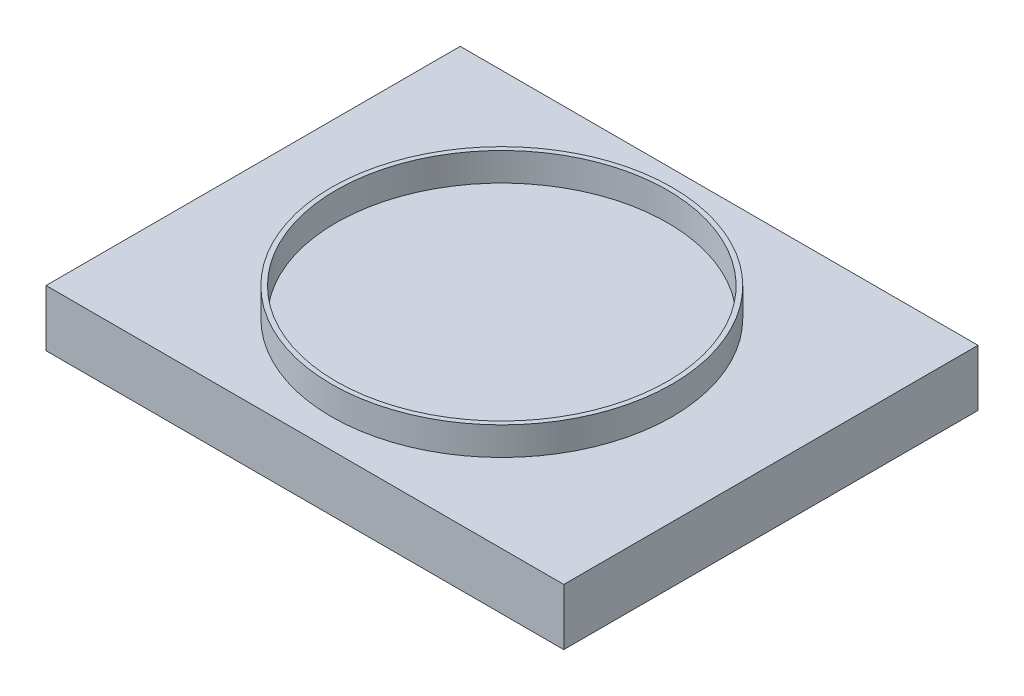
ISO-10303-21;
HEADER;
FILE_DESCRIPTION(('STEP AP214'),'2;1');
FILE_NAME('part.step','',(''),(''),'','','');
FILE_SCHEMA(('AUTOMOTIVE_DESIGN { 1 0 10303 214 1 1 1 1 }'));
ENDSEC;
DATA;
#1=APPLICATION_CONTEXT('core data for automotive mechanical design processes');
#2=APPLICATION_PROTOCOL_DEFINITION('international standard','automotive_design',2000,#1);
#3=PRODUCT_CONTEXT('',#1,'mechanical');
#4=PRODUCT('Part','Part','',(#3));
#5=PRODUCT_RELATED_PRODUCT_CATEGORY('part','',(#4));
#6=PRODUCT_DEFINITION_FORMATION('','',#4);
#7=PRODUCT_DEFINITION_CONTEXT('part definition',#1,'design');
#8=PRODUCT_DEFINITION('design','',#6,#7);
#9=PRODUCT_DEFINITION_SHAPE('','',#8);
#10=(LENGTH_UNIT() NAMED_UNIT(*) SI_UNIT(.MILLI.,.METRE.));
#11=(NAMED_UNIT(*) PLANE_ANGLE_UNIT() SI_UNIT($,.RADIAN.));
#12=(NAMED_UNIT(*) SI_UNIT($,.STERADIAN.) SOLID_ANGLE_UNIT());
#13=UNCERTAINTY_MEASURE_WITH_UNIT(LENGTH_MEASURE(1.E-05),#10,'distance_accuracy_value','');
#14=(GEOMETRIC_REPRESENTATION_CONTEXT(3) GLOBAL_UNCERTAINTY_ASSIGNED_CONTEXT((#13)) GLOBAL_UNIT_ASSIGNED_CONTEXT((#10,
#11,#12)) REPRESENTATION_CONTEXT('',''));
#15=CARTESIAN_POINT('',(0.,0.,0.));
#16=DIRECTION('',(0.,0.,1.));
#17=DIRECTION('',(1.,0.,0.));
#18=AXIS2_PLACEMENT_3D('',#15,#16,#17);
#19=CARTESIAN_POINT('',(0.,3.,46.7904600702146));
#20=DIRECTION('',(0.,-1.,0.));
#21=DIRECTION('',(0.,0.,-1.));
#22=AXIS2_PLACEMENT_3D('',#19,#20,#21);
#23=CYLINDRICAL_SURFACE('',#22,18.1);
#24=CARTESIAN_POINT('',(0.,0.,46.7904600702146));
#25=DIRECTION('',(0.,1.,0.));
#26=DIRECTION('',(0.,0.,1.));
#27=AXIS2_PLACEMENT_3D('',#24,#25,#26);
#28=CIRCLE('',#27,18.1);
#29=CARTESIAN_POINT('',(0.,0.,64.8904600702146));
#30=VERTEX_POINT('',#29);
#31=EDGE_CURVE('E41',#30,#30,#28,.T.);
#32=ORIENTED_EDGE('',*,*,#31,.T.);
#33=EDGE_LOOP('',(#32));
#34=FACE_BOUND('',#33,.T.);
#35=CARTESIAN_POINT('',(0.,3.,46.7904600702146));
#36=DIRECTION('',(0.,1.,0.));
#37=DIRECTION('',(0.,0.,1.));
#38=AXIS2_PLACEMENT_3D('',#35,#36,#37);
#39=CIRCLE('',#38,18.1);
#40=CARTESIAN_POINT('',(0.,3.,64.8904600702146));
#41=VERTEX_POINT('',#40);
#42=EDGE_CURVE('E11',#41,#41,#39,.T.);
#43=ORIENTED_EDGE('',*,*,#42,.F.);
#44=EDGE_LOOP('',(#43));
#45=FACE_BOUND('',#44,.T.);
#46=ADVANCED_FACE('F38',(#34,#45),#23,.T.);
#47=CARTESIAN_POINT('',(0.,3.,46.7904600702146));
#48=DIRECTION('',(0.,1.,0.));
#49=DIRECTION('',(0.,0.,1.));
#50=AXIS2_PLACEMENT_3D('',#47,#48,#49);
#51=PLANE('',#50);
#52=CARTESIAN_POINT('',(0.,3.,46.7904600702146));
#53=DIRECTION('',(0.,1.,0.));
#54=DIRECTION('',(0.,0.,1.));
#55=AXIS2_PLACEMENT_3D('',#52,#53,#54);
#56=CIRCLE('',#55,17.6);
#57=CARTESIAN_POINT('',(0.,3.,64.3904600702146));
#58=VERTEX_POINT('',#57);
#59=EDGE_CURVE('E46',#58,#58,#56,.T.);
#60=ORIENTED_EDGE('',*,*,#59,.F.);
#61=EDGE_LOOP('',(#60));
#62=FACE_BOUND('',#61,.T.);
#63=ORIENTED_EDGE('',*,*,#42,.T.);
#64=EDGE_LOOP('',(#63));
#65=FACE_BOUND('',#64,.T.);
#66=ADVANCED_FACE('F212',(#62,#65),#51,.T.);
#67=CARTESIAN_POINT('',(0.,3.,46.7904600702146));
#68=DIRECTION('',(0.,-1.,0.));
#69=DIRECTION('',(0.,0.,-1.));
#70=AXIS2_PLACEMENT_3D('',#67,#68,#69);
#71=CYLINDRICAL_SURFACE('',#70,17.6);
#72=ORIENTED_EDGE('',*,*,#59,.T.);
#73=EDGE_LOOP('',(#72));
#74=FACE_BOUND('',#73,.T.);
#75=CARTESIAN_POINT('',(0.,0.,46.7904600702146));
#76=DIRECTION('',(0.,1.,0.));
#77=DIRECTION('',(0.,0.,1.));
#78=AXIS2_PLACEMENT_3D('',#75,#76,#77);
#79=CIRCLE('',#78,17.6);
#80=CARTESIAN_POINT('',(0.,0.,64.3904600702146));
#81=VERTEX_POINT('',#80);
#82=EDGE_CURVE('E178',#81,#81,#79,.T.);
#83=ORIENTED_EDGE('',*,*,#82,.F.);
#84=EDGE_LOOP('',(#83));
#85=FACE_BOUND('',#84,.T.);
#86=ADVANCED_FACE('F216',(#74,#85),#71,.F.);
#87=CARTESIAN_POINT('',(0.,0.,46.7904600702146));
#88=DIRECTION('',(0.,1.,0.));
#89=DIRECTION('',(0.,0.,1.));
#90=AXIS2_PLACEMENT_3D('',#87,#88,#89);
#91=PLANE('',#90);
#92=ORIENTED_EDGE('',*,*,#82,.T.);
#93=EDGE_LOOP('',(#92));
#94=FACE_BOUND('',#93,.T.);
#95=ADVANCED_FACE('F209',(#94),#91,.T.);
#96=CARTESIAN_POINT('',(27.7675454174685,-6.,67.974099662761));
#97=DIRECTION('',(0.,0.,-1.));
#98=DIRECTION('',(-1.,0.,0.));
#99=AXIS2_PLACEMENT_3D('',#96,#97,#98);
#100=PLANE('',#99);
#101=DIRECTION('',(-1.,0.,0.));
#102=VECTOR('',#101,1.);
#103=CARTESIAN_POINT('',(27.7675454174685,0.,67.974099662761));
#104=LINE('',#103,#102);
#105=CARTESIAN_POINT('',(27.7675454174685,0.,67.974099662761));
#106=VERTEX_POINT('',#105);
#107=CARTESIAN_POINT('',(-27.2324545825315,0.,67.974099662761));
#108=VERTEX_POINT('',#107);
#109=EDGE_CURVE('E147',#106,#108,#104,.T.);
#110=ORIENTED_EDGE('',*,*,#109,.T.);
#111=DIRECTION('',(0.,1.,0.));
#112=VECTOR('',#111,1.);
#113=CARTESIAN_POINT('',(-27.2324545825315,-6.,67.974099662761));
#114=LINE('',#113,#112);
#115=CARTESIAN_POINT('',(-27.2324545825315,-6.,67.974099662761));
#116=VERTEX_POINT('',#115);
#117=EDGE_CURVE('E174',#116,#108,#114,.T.);
#118=ORIENTED_EDGE('',*,*,#117,.F.);
#119=DIRECTION('',(-1.,0.,0.));
#120=VECTOR('',#119,1.);
#121=CARTESIAN_POINT('',(27.7675454174685,-6.,67.974099662761));
#122=LINE('',#121,#120);
#123=CARTESIAN_POINT('',(27.7675454174685,-6.,67.974099662761));
#124=VERTEX_POINT('',#123);
#125=EDGE_CURVE('E88',#124,#116,#122,.T.);
#126=ORIENTED_EDGE('',*,*,#125,.F.);
#127=DIRECTION('',(0.,1.,0.));
#128=VECTOR('',#127,1.);
#129=CARTESIAN_POINT('',(27.7675454174685,-6.,67.974099662761));
#130=LINE('',#129,#128);
#131=EDGE_CURVE('E159',#124,#106,#130,.T.);
#132=ORIENTED_EDGE('',*,*,#131,.T.);
#133=EDGE_LOOP('',(#110,#118,#126,#132));
#134=FACE_BOUND('',#133,.T.);
#135=ADVANCED_FACE('F196',(#134),#100,.F.);
#136=CARTESIAN_POINT('',(-27.2324545825315,-6.,23.974099662761));
#137=DIRECTION('',(-1.,0.,0.));
#138=DIRECTION('',(0.,0.,1.));
#139=AXIS2_PLACEMENT_3D('',#136,#137,#138);
#140=PLANE('',#139);
#141=DIRECTION('',(0.,0.,1.));
#142=VECTOR('',#141,1.);
#143=CARTESIAN_POINT('',(-27.2324545825315,0.,23.974099662761));
#144=LINE('',#143,#142);
#145=CARTESIAN_POINT('',(-27.2324545825315,0.,23.974099662761));
#146=VERTEX_POINT('',#145);
#147=EDGE_CURVE('E162',#146,#108,#144,.T.);
#148=ORIENTED_EDGE('',*,*,#147,.F.);
#149=DIRECTION('',(0.,1.,0.));
#150=VECTOR('',#149,1.);
#151=CARTESIAN_POINT('',(-27.2324545825315,-6.,23.974099662761));
#152=LINE('',#151,#150);
#153=CARTESIAN_POINT('',(-27.2324545825315,-6.,23.974099662761));
#154=VERTEX_POINT('',#153);
#155=EDGE_CURVE('E172',#154,#146,#152,.T.);
#156=ORIENTED_EDGE('',*,*,#155,.F.);
#157=DIRECTION('',(0.,0.,1.));
#158=VECTOR('',#157,1.);
#159=CARTESIAN_POINT('',(-27.2324545825315,-6.,23.974099662761));
#160=LINE('',#159,#158);
#161=EDGE_CURVE('E152',#154,#116,#160,.T.);
#162=ORIENTED_EDGE('',*,*,#161,.T.);
#163=ORIENTED_EDGE('',*,*,#117,.T.);
#164=EDGE_LOOP('',(#148,#156,#162,#163));
#165=FACE_BOUND('',#164,.T.);
#166=ADVANCED_FACE('F201',(#165),#140,.T.);
#167=CARTESIAN_POINT('',(27.7675454174685,-6.,23.9740996627611));
#168=DIRECTION('',(0.,0.,-1.));
#169=DIRECTION('',(-1.,0.,0.));
#170=AXIS2_PLACEMENT_3D('',#167,#168,#169);
#171=PLANE('',#170);
#172=DIRECTION('',(-1.,0.,0.));
#173=VECTOR('',#172,1.);
#174=CARTESIAN_POINT('',(27.7675454174685,0.,23.9740996627611));
#175=LINE('',#174,#173);
#176=CARTESIAN_POINT('',(27.7675454174685,0.,23.9740996627611));
#177=VERTEX_POINT('',#176);
#178=EDGE_CURVE('E165',#177,#146,#175,.T.);
#179=ORIENTED_EDGE('',*,*,#178,.F.);
#180=DIRECTION('',(0.,1.,0.));
#181=VECTOR('',#180,1.);
#182=CARTESIAN_POINT('',(27.7675454174685,-6.,23.9740996627611));
#183=LINE('',#182,#181);
#184=CARTESIAN_POINT('',(27.7675454174685,-6.,23.9740996627611));
#185=VERTEX_POINT('',#184);
#186=EDGE_CURVE('E170',#185,#177,#183,.T.);
#187=ORIENTED_EDGE('',*,*,#186,.F.);
#188=DIRECTION('',(-1.,0.,0.));
#189=VECTOR('',#188,1.);
#190=CARTESIAN_POINT('',(27.7675454174685,-6.,23.9740996627611));
#191=LINE('',#190,#189);
#192=EDGE_CURVE('E155',#185,#154,#191,.T.);
#193=ORIENTED_EDGE('',*,*,#192,.T.);
#194=ORIENTED_EDGE('',*,*,#155,.T.);
#195=EDGE_LOOP('',(#179,#187,#193,#194));
#196=FACE_BOUND('',#195,.T.);
#197=ADVANCED_FACE('F199',(#196),#171,.T.);
#198=CARTESIAN_POINT('',(27.7675454174685,-6.,23.9740996627611));
#199=DIRECTION('',(-1.,0.,0.));
#200=DIRECTION('',(0.,0.,1.));
#201=AXIS2_PLACEMENT_3D('',#198,#199,#200);
#202=PLANE('',#201);
#203=DIRECTION('',(0.,0.,1.));
#204=VECTOR('',#203,1.);
#205=CARTESIAN_POINT('',(27.7675454174685,0.,23.9740996627611));
#206=LINE('',#205,#204);
#207=EDGE_CURVE('E83',#177,#106,#206,.T.);
#208=ORIENTED_EDGE('',*,*,#207,.T.);
#209=ORIENTED_EDGE('',*,*,#131,.F.);
#210=DIRECTION('',(0.,0.,1.));
#211=VECTOR('',#210,1.);
#212=CARTESIAN_POINT('',(27.7675454174685,-6.,23.9740996627611));
#213=LINE('',#212,#211);
#214=EDGE_CURVE('E62',#185,#124,#213,.T.);
#215=ORIENTED_EDGE('',*,*,#214,.F.);
#216=ORIENTED_EDGE('',*,*,#186,.T.);
#217=EDGE_LOOP('',(#208,#209,#215,#216));
#218=FACE_BOUND('',#217,.T.);
#219=ADVANCED_FACE('F197',(#218),#202,.F.);
#220=CARTESIAN_POINT('',(0.,-6.,0.));
#221=DIRECTION('',(0.,1.,0.));
#222=DIRECTION('',(0.,0.,1.));
#223=AXIS2_PLACEMENT_3D('',#220,#221,#222);
#224=PLANE('',#223);
#225=DIRECTION('',(-1.,0.,0.));
#226=VECTOR('',#225,1.);
#227=CARTESIAN_POINT('',(26.3354418438767,-6.,66.5708787902191));
#228=LINE('',#227,#226);
#229=CARTESIAN_POINT('',(26.3354418438767,-6.,66.5708787902191));
#230=VERTEX_POINT('',#229);
#231=CARTESIAN_POINT('',(-25.9190201233016,-6.,66.5708787902191));
#232=VERTEX_POINT('',#231);
#233=EDGE_CURVE('E141',#230,#232,#228,.T.);
#234=ORIENTED_EDGE('',*,*,#233,.F.);
#235=DIRECTION('',(0.,0.,1.));
#236=VECTOR('',#235,1.);
#237=CARTESIAN_POINT('',(26.3354418438767,-6.,25.4800692386375));
#238=LINE('',#237,#236);
#239=CARTESIAN_POINT('',(26.3354418438767,-6.,25.4800692386375));
#240=VERTEX_POINT('',#239);
#241=EDGE_CURVE('E53',#240,#230,#238,.T.);
#242=ORIENTED_EDGE('',*,*,#241,.F.);
#243=DIRECTION('',(1.,0.,0.));
#244=VECTOR('',#243,1.);
#245=CARTESIAN_POINT('',(26.3354418438767,-6.,25.4800692386375));
#246=LINE('',#245,#244);
#247=CARTESIAN_POINT('',(-25.9190201233016,-6.,25.4800692386375));
#248=VERTEX_POINT('',#247);
#249=EDGE_CURVE('E132',#248,#240,#246,.T.);
#250=ORIENTED_EDGE('',*,*,#249,.F.);
#251=DIRECTION('',(0.,0.,-1.));
#252=VECTOR('',#251,1.);
#253=CARTESIAN_POINT('',(-25.9190201233016,-6.,25.4800692386375));
#254=LINE('',#253,#252);
#255=EDGE_CURVE('E135',#232,#248,#254,.T.);
#256=ORIENTED_EDGE('',*,*,#255,.F.);
#257=EDGE_LOOP('',(#234,#242,#250,#256));
#258=FACE_BOUND('',#257,.T.);
#259=ORIENTED_EDGE('',*,*,#125,.T.);
#260=ORIENTED_EDGE('',*,*,#161,.F.);
#261=ORIENTED_EDGE('',*,*,#192,.F.);
#262=ORIENTED_EDGE('',*,*,#214,.T.);
#263=EDGE_LOOP('',(#259,#260,#261,#262));
#264=FACE_BOUND('',#263,.T.);
#265=ADVANCED_FACE('F190',(#258,#264),#224,.F.);
#266=CARTESIAN_POINT('',(0.,0.,0.));
#267=DIRECTION('',(0.,1.,0.));
#268=DIRECTION('',(0.,0.,1.));
#269=AXIS2_PLACEMENT_3D('',#266,#267,#268);
#270=PLANE('',#269);
#271=ORIENTED_EDGE('',*,*,#31,.F.);
#272=EDGE_LOOP('',(#271));
#273=FACE_BOUND('',#272,.T.);
#274=ORIENTED_EDGE('',*,*,#109,.F.);
#275=ORIENTED_EDGE('',*,*,#207,.F.);
#276=ORIENTED_EDGE('',*,*,#178,.T.);
#277=ORIENTED_EDGE('',*,*,#147,.T.);
#278=EDGE_LOOP('',(#274,#275,#276,#277));
#279=FACE_BOUND('',#278,.T.);
#280=ADVANCED_FACE('F187',(#273,#279),#270,.T.);
#281=CARTESIAN_POINT('',(26.3354418438767,-1.,25.4800692386375));
#282=DIRECTION('',(1.,0.,0.));
#283=DIRECTION('',(0.,0.,-1.));
#284=AXIS2_PLACEMENT_3D('',#281,#282,#283);
#285=PLANE('',#284);
#286=ORIENTED_EDGE('',*,*,#241,.T.);
#287=DIRECTION('',(0.,-1.,0.));
#288=VECTOR('',#287,1.);
#289=CARTESIAN_POINT('',(26.3354418438767,-1.,66.5708787902191));
#290=LINE('',#289,#288);
#291=CARTESIAN_POINT('',(26.3354418438767,-1.,66.5708787902191));
#292=VERTEX_POINT('',#291);
#293=EDGE_CURVE('E110',#292,#230,#290,.T.);
#294=ORIENTED_EDGE('',*,*,#293,.F.);
#295=DIRECTION('',(0.,0.,1.));
#296=VECTOR('',#295,1.);
#297=CARTESIAN_POINT('',(26.3354418438767,-1.,25.4800692386375));
#298=LINE('',#297,#296);
#299=CARTESIAN_POINT('',(26.3354418438767,-1.,25.4800692386375));
#300=VERTEX_POINT('',#299);
#301=EDGE_CURVE('E114',#300,#292,#298,.T.);
#302=ORIENTED_EDGE('',*,*,#301,.F.);
#303=DIRECTION('',(0.,-1.,0.));
#304=VECTOR('',#303,1.);
#305=CARTESIAN_POINT('',(26.3354418438767,-1.,25.4800692386375));
#306=LINE('',#305,#304);
#307=EDGE_CURVE('E145',#300,#240,#306,.T.);
#308=ORIENTED_EDGE('',*,*,#307,.T.);
#309=EDGE_LOOP('',(#286,#294,#302,#308));
#310=FACE_BOUND('',#309,.T.);
#311=ADVANCED_FACE('F112',(#310),#285,.F.);
#312=CARTESIAN_POINT('',(26.3354418438767,-1.,25.4800692386375));
#313=DIRECTION('',(0.,0.,-1.));
#314=DIRECTION('',(-1.,0.,0.));
#315=AXIS2_PLACEMENT_3D('',#312,#313,#314);
#316=PLANE('',#315);
#317=ORIENTED_EDGE('',*,*,#249,.T.);
#318=ORIENTED_EDGE('',*,*,#307,.F.);
#319=DIRECTION('',(1.,0.,0.));
#320=VECTOR('',#319,1.);
#321=CARTESIAN_POINT('',(26.3354418438767,-1.,25.4800692386375));
#322=LINE('',#321,#320);
#323=CARTESIAN_POINT('',(-25.9190201233016,-1.,25.4800692386375));
#324=VERTEX_POINT('',#323);
#325=EDGE_CURVE('E120',#324,#300,#322,.T.);
#326=ORIENTED_EDGE('',*,*,#325,.F.);
#327=DIRECTION('',(0.,-1.,0.));
#328=VECTOR('',#327,1.);
#329=CARTESIAN_POINT('',(-25.9190201233016,-1.,25.4800692386375));
#330=LINE('',#329,#328);
#331=EDGE_CURVE('E148',#324,#248,#330,.T.);
#332=ORIENTED_EDGE('',*,*,#331,.T.);
#333=EDGE_LOOP('',(#317,#318,#326,#332));
#334=FACE_BOUND('',#333,.T.);
#335=ADVANCED_FACE('F279',(#334),#316,.F.);
#336=CARTESIAN_POINT('',(-25.9190201233016,-1.,25.4800692386375));
#337=DIRECTION('',(-1.,0.,0.));
#338=DIRECTION('',(0.,0.,1.));
#339=AXIS2_PLACEMENT_3D('',#336,#337,#338);
#340=PLANE('',#339);
#341=ORIENTED_EDGE('',*,*,#255,.T.);
#342=ORIENTED_EDGE('',*,*,#331,.F.);
#343=DIRECTION('',(0.,0.,-1.));
#344=VECTOR('',#343,1.);
#345=CARTESIAN_POINT('',(-25.9190201233016,-1.,25.4800692386375));
#346=LINE('',#345,#344);
#347=CARTESIAN_POINT('',(-25.9190201233016,-1.,66.5708787902191));
#348=VERTEX_POINT('',#347);
#349=EDGE_CURVE('E128',#348,#324,#346,.T.);
#350=ORIENTED_EDGE('',*,*,#349,.F.);
#351=DIRECTION('',(0.,-1.,0.));
#352=VECTOR('',#351,1.);
#353=CARTESIAN_POINT('',(-25.9190201233016,-1.,66.5708787902191));
#354=LINE('',#353,#352);
#355=EDGE_CURVE('E119',#348,#232,#354,.T.);
#356=ORIENTED_EDGE('',*,*,#355,.T.);
#357=EDGE_LOOP('',(#341,#342,#350,#356));
#358=FACE_BOUND('',#357,.T.);
#359=ADVANCED_FACE('F288',(#358),#340,.F.);
#360=CARTESIAN_POINT('',(26.3354418438767,-1.,66.5708787902191));
#361=DIRECTION('',(0.,0.,1.));
#362=DIRECTION('',(1.,0.,0.));
#363=AXIS2_PLACEMENT_3D('',#360,#361,#362);
#364=PLANE('',#363);
#365=ORIENTED_EDGE('',*,*,#233,.T.);
#366=ORIENTED_EDGE('',*,*,#355,.F.);
#367=DIRECTION('',(-1.,0.,0.));
#368=VECTOR('',#367,1.);
#369=CARTESIAN_POINT('',(26.3354418438767,-1.,66.5708787902191));
#370=LINE('',#369,#368);
#371=EDGE_CURVE('E123',#292,#348,#370,.T.);
#372=ORIENTED_EDGE('',*,*,#371,.F.);
#373=ORIENTED_EDGE('',*,*,#293,.T.);
#374=EDGE_LOOP('',(#365,#366,#372,#373));
#375=FACE_BOUND('',#374,.T.);
#376=ADVANCED_FACE('F124',(#375),#364,.F.);
#377=CARTESIAN_POINT('',(0.,-1.,0.));
#378=DIRECTION('',(0.,-1.,0.));
#379=DIRECTION('',(0.,0.,-1.));
#380=AXIS2_PLACEMENT_3D('',#377,#378,#379);
#381=PLANE('',#380);
#382=ORIENTED_EDGE('',*,*,#301,.T.);
#383=ORIENTED_EDGE('',*,*,#371,.T.);
#384=ORIENTED_EDGE('',*,*,#349,.T.);
#385=ORIENTED_EDGE('',*,*,#325,.T.);
#386=EDGE_LOOP('',(#382,#383,#384,#385));
#387=FACE_BOUND('',#386,.T.);
#388=ADVANCED_FACE('F130',(#387),#381,.T.);
#389=CLOSED_SHELL('',(#46,#66,#86,#95,#135,#166,#197,#219,#265,#280,#311,#335,#359,#376,#388));
#390=MANIFOLD_SOLID_BREP('B2',#389);
#391=ADVANCED_BREP_SHAPE_REPRESENTATION('',(#18,#390),#14);
#392=SHAPE_DEFINITION_REPRESENTATION(#9,#391);
ENDSEC;
END-ISO-10303-21;
